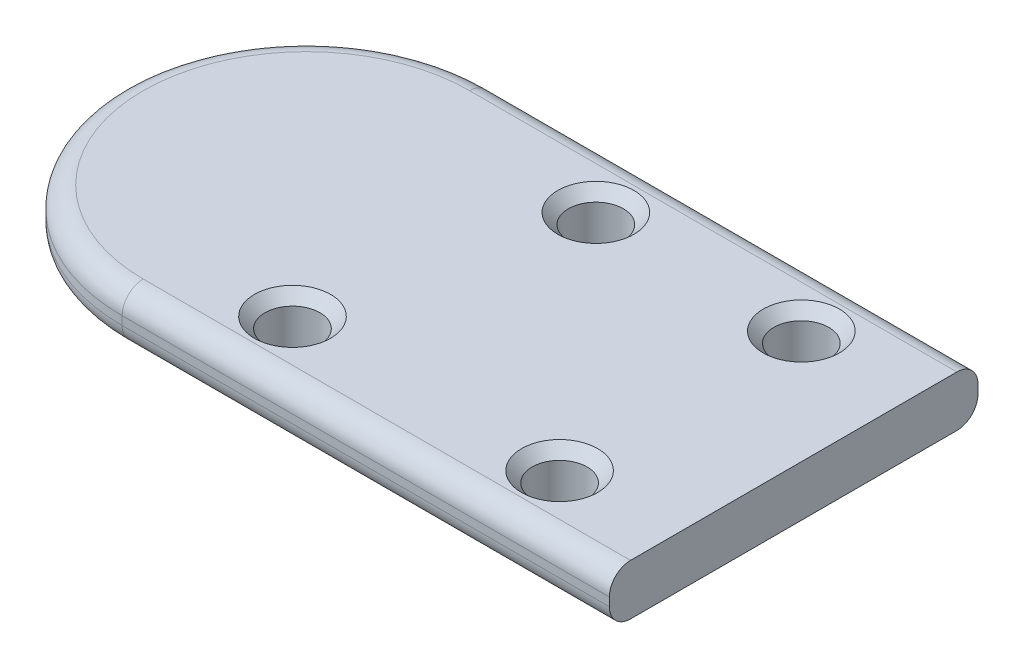
ISO-10303-21;
HEADER;
FILE_DESCRIPTION(('STEP AP214'),'2;1');
FILE_NAME('part.step','',(''),(''),'','','');
FILE_SCHEMA(('AUTOMOTIVE_DESIGN { 1 0 10303 214 1 1 1 1 }'));
ENDSEC;
DATA;
#1=APPLICATION_CONTEXT('core data for automotive mechanical design processes');
#2=APPLICATION_PROTOCOL_DEFINITION('international standard','automotive_design',2000,#1);
#3=PRODUCT_CONTEXT('',#1,'mechanical');
#4=PRODUCT('Part','Part','',(#3));
#5=PRODUCT_RELATED_PRODUCT_CATEGORY('part','',(#4));
#6=PRODUCT_DEFINITION_FORMATION('','',#4);
#7=PRODUCT_DEFINITION_CONTEXT('part definition',#1,'design');
#8=PRODUCT_DEFINITION('design','',#6,#7);
#9=PRODUCT_DEFINITION_SHAPE('','',#8);
#10=(LENGTH_UNIT() NAMED_UNIT(*) SI_UNIT(.MILLI.,.METRE.));
#11=(NAMED_UNIT(*) PLANE_ANGLE_UNIT() SI_UNIT($,.RADIAN.));
#12=(NAMED_UNIT(*) SI_UNIT($,.STERADIAN.) SOLID_ANGLE_UNIT());
#13=UNCERTAINTY_MEASURE_WITH_UNIT(LENGTH_MEASURE(1.E-05),#10,'distance_accuracy_value','');
#14=(GEOMETRIC_REPRESENTATION_CONTEXT(3) GLOBAL_UNCERTAINTY_ASSIGNED_CONTEXT((#13)) GLOBAL_UNIT_ASSIGNED_CONTEXT((#10,
#11,#12)) REPRESENTATION_CONTEXT('',''));
#15=CARTESIAN_POINT('',(0.,0.,0.));
#16=DIRECTION('',(0.,0.,1.));
#17=DIRECTION('',(1.,0.,0.));
#18=AXIS2_PLACEMENT_3D('',#15,#16,#17);
#19=CARTESIAN_POINT('',(-65.005,2.4,0.));
#20=DIRECTION('',(0.,-1.,0.));
#21=DIRECTION('',(0.,0.,-1.));
#22=AXIS2_PLACEMENT_3D('',#19,#20,#21);
#23=CYLINDRICAL_SURFACE('',#22,17.43);
#24=DIRECTION('',(0.,-1.,0.));
#25=VECTOR('',#24,1.);
#26=CARTESIAN_POINT('',(-65.005,2.4,17.43));
#27=LINE('',#26,#25);
#28=CARTESIAN_POINT('',(-65.005,0.4,17.43));
#29=VERTEX_POINT('',#28);
#30=CARTESIAN_POINT('',(-65.005,-0.4,17.43));
#31=VERTEX_POINT('',#30);
#32=EDGE_CURVE('E302',#29,#31,#27,.T.);
#33=ORIENTED_EDGE('',*,*,#32,.F.);
#34=CARTESIAN_POINT('',(-65.005,0.4,0.));
#35=DIRECTION('',(0.,1.,0.));
#36=DIRECTION('',(0.,0.,1.));
#37=AXIS2_PLACEMENT_3D('',#34,#35,#36);
#38=CIRCLE('',#37,17.43);
#39=CARTESIAN_POINT('',(-65.005,0.4,-17.43));
#40=VERTEX_POINT('',#39);
#41=EDGE_CURVE('E155',#29,#40,#38,.F.);
#42=ORIENTED_EDGE('',*,*,#41,.T.);
#43=DIRECTION('',(0.,-1.,0.));
#44=VECTOR('',#43,1.);
#45=CARTESIAN_POINT('',(-65.005,2.4,-17.43));
#46=LINE('',#45,#44);
#47=CARTESIAN_POINT('',(-65.005,-0.4,-17.43));
#48=VERTEX_POINT('',#47);
#49=EDGE_CURVE('E299',#40,#48,#46,.T.);
#50=ORIENTED_EDGE('',*,*,#49,.T.);
#51=CARTESIAN_POINT('',(-65.005,-0.4,0.));
#52=DIRECTION('',(0.,1.,0.));
#53=DIRECTION('',(0.,0.,1.));
#54=AXIS2_PLACEMENT_3D('',#51,#52,#53);
#55=CIRCLE('',#54,17.43);
#56=EDGE_CURVE('E64',#48,#31,#55,.T.);
#57=ORIENTED_EDGE('',*,*,#56,.T.);
#58=EDGE_LOOP('',(#33,#42,#50,#57));
#59=FACE_BOUND('',#58,.T.);
#60=ADVANCED_FACE('F40',(#59),#23,.T.);
#61=CARTESIAN_POINT('',(-65.005,2.4,17.43));
#62=DIRECTION('',(0.,0.,-1.));
#63=DIRECTION('',(-1.,0.,0.));
#64=AXIS2_PLACEMENT_3D('',#61,#62,#63);
#65=PLANE('',#64);
#66=DIRECTION('',(1.,0.,0.));
#67=VECTOR('',#66,1.);
#68=CARTESIAN_POINT('',(-65.005,-0.4,17.43));
#69=LINE('',#68,#67);
#70=CARTESIAN_POINT('',(-18.9276397409612,-0.399999999999999,17.4299999999999));
#71=VERTEX_POINT('',#70);
#72=EDGE_CURVE('E146',#31,#71,#69,.T.);
#73=ORIENTED_EDGE('',*,*,#72,.T.);
#74=DIRECTION('',(0.,1.,0.));
#75=VECTOR('',#74,1.);
#76=CARTESIAN_POINT('',(-18.9276397409612,-7.6,17.4299999999999));
#77=LINE('',#76,#75);
#78=CARTESIAN_POINT('',(-18.9276397409612,0.399999999999999,17.4299999999999));
#79=VERTEX_POINT('',#78);
#80=EDGE_CURVE('E122',#71,#79,#77,.T.);
#81=ORIENTED_EDGE('',*,*,#80,.T.);
#82=DIRECTION('',(1.,0.,0.));
#83=VECTOR('',#82,1.);
#84=CARTESIAN_POINT('',(-65.005,0.4,17.43));
#85=LINE('',#84,#83);
#86=EDGE_CURVE('E150',#79,#29,#85,.F.);
#87=ORIENTED_EDGE('',*,*,#86,.T.);
#88=ORIENTED_EDGE('',*,*,#32,.T.);
#89=EDGE_LOOP('',(#73,#81,#87,#88));
#90=FACE_BOUND('',#89,.T.);
#91=ADVANCED_FACE('F220',(#90),#65,.F.);
#92=CARTESIAN_POINT('',(-65.005,2.4,-17.43));
#93=DIRECTION('',(0.,0.,1.));
#94=DIRECTION('',(1.,0.,0.));
#95=AXIS2_PLACEMENT_3D('',#92,#93,#94);
#96=PLANE('',#95);
#97=DIRECTION('',(-1.,0.,0.));
#98=VECTOR('',#97,1.);
#99=CARTESIAN_POINT('',(65.005,0.4,-17.43));
#100=LINE('',#99,#98);
#101=CARTESIAN_POINT('',(-18.9276397409612,0.399999999999999,-17.43));
#102=VERTEX_POINT('',#101);
#103=EDGE_CURVE('E120',#40,#102,#100,.F.);
#104=ORIENTED_EDGE('',*,*,#103,.T.);
#105=DIRECTION('',(0.,1.,0.));
#106=VECTOR('',#105,1.);
#107=CARTESIAN_POINT('',(-18.9276397409612,-7.6,-17.43));
#108=LINE('',#107,#106);
#109=CARTESIAN_POINT('',(-18.9276397409612,-0.399999999999999,-17.43));
#110=VERTEX_POINT('',#109);
#111=EDGE_CURVE('E107',#110,#102,#108,.T.);
#112=ORIENTED_EDGE('',*,*,#111,.F.);
#113=DIRECTION('',(-1.,0.,0.));
#114=VECTOR('',#113,1.);
#115=CARTESIAN_POINT('',(-65.005,-0.4,-17.43));
#116=LINE('',#115,#114);
#117=EDGE_CURVE('E117',#110,#48,#116,.T.);
#118=ORIENTED_EDGE('',*,*,#117,.T.);
#119=ORIENTED_EDGE('',*,*,#49,.F.);
#120=EDGE_LOOP('',(#104,#112,#118,#119));
#121=FACE_BOUND('',#120,.T.);
#122=ADVANCED_FACE('F115',(#121),#96,.F.);
#123=CARTESIAN_POINT('',(-65.005,2.4,0.));
#124=DIRECTION('',(0.,1.,0.));
#125=DIRECTION('',(0.,0.,1.));
#126=AXIS2_PLACEMENT_3D('',#123,#124,#125);
#127=PLANE('',#126);
#128=DIRECTION('',(0.,0.,1.));
#129=VECTOR('',#128,1.);
#130=CARTESIAN_POINT('',(-18.9276397409612,2.4,-17.43));
#131=LINE('',#130,#129);
#132=CARTESIAN_POINT('',(-18.9276397409612,2.4,-15.43));
#133=VERTEX_POINT('',#132);
#134=CARTESIAN_POINT('',(-18.9276397409612,2.4,15.4299999999999));
#135=VERTEX_POINT('',#134);
#136=EDGE_CURVE('E314',#133,#135,#131,.T.);
#137=ORIENTED_EDGE('',*,*,#136,.F.);
#138=DIRECTION('',(-1.,0.,0.));
#139=VECTOR('',#138,1.);
#140=CARTESIAN_POINT('',(-65.005,2.4,-15.43));
#141=LINE('',#140,#139);
#142=CARTESIAN_POINT('',(-65.005,2.4,-15.43));
#143=VERTEX_POINT('',#142);
#144=EDGE_CURVE('E128',#133,#143,#141,.T.);
#145=ORIENTED_EDGE('',*,*,#144,.T.);
#146=CARTESIAN_POINT('',(-65.005,2.4,0.));
#147=DIRECTION('',(0.,1.,0.));
#148=DIRECTION('',(0.,0.,1.));
#149=AXIS2_PLACEMENT_3D('',#146,#147,#148);
#150=CIRCLE('',#149,15.43);
#151=CARTESIAN_POINT('',(-65.005,2.4,15.4299999999999));
#152=VERTEX_POINT('',#151);
#153=EDGE_CURVE('E305',#143,#152,#150,.T.);
#154=ORIENTED_EDGE('',*,*,#153,.T.);
#155=DIRECTION('',(1.,0.,0.));
#156=VECTOR('',#155,1.);
#157=CARTESIAN_POINT('',(65.005,2.4,15.4299999999999));
#158=LINE('',#157,#156);
#159=EDGE_CURVE('E134',#152,#135,#158,.T.);
#160=ORIENTED_EDGE('',*,*,#159,.T.);
#161=EDGE_LOOP('',(#137,#145,#154,#160));
#162=FACE_BOUND('',#161,.T.);
#163=CARTESIAN_POINT('',(-29.635,2.4,11.43));
#164=DIRECTION('',(0.,1.,0.));
#165=DIRECTION('',(0.,0.,1.));
#166=AXIS2_PLACEMENT_3D('',#163,#164,#165);
#167=CIRCLE('',#166,3.59999999999998);
#168=CARTESIAN_POINT('',(-29.635,2.4,15.0299999999999));
#169=VERTEX_POINT('',#168);
#170=EDGE_CURVE('E190',#169,#169,#167,.F.);
#171=ORIENTED_EDGE('',*,*,#170,.T.);
#172=EDGE_LOOP('',(#171));
#173=FACE_BOUND('',#172,.T.);
#174=CARTESIAN_POINT('',(-54.895,2.4,11.43));
#175=DIRECTION('',(0.,1.,0.));
#176=DIRECTION('',(0.,0.,1.));
#177=AXIS2_PLACEMENT_3D('',#174,#175,#176);
#178=CIRCLE('',#177,3.59999999999998);
#179=CARTESIAN_POINT('',(-54.895,2.4,15.0299999999999));
#180=VERTEX_POINT('',#179);
#181=EDGE_CURVE('E186',#180,#180,#178,.F.);
#182=ORIENTED_EDGE('',*,*,#181,.T.);
#183=EDGE_LOOP('',(#182));
#184=FACE_BOUND('',#183,.T.);
#185=CARTESIAN_POINT('',(-29.635,2.4,-11.43));
#186=DIRECTION('',(0.,1.,0.));
#187=DIRECTION('',(0.,0.,1.));
#188=AXIS2_PLACEMENT_3D('',#185,#186,#187);
#189=CIRCLE('',#188,3.60000000000002);
#190=CARTESIAN_POINT('',(-29.635,2.4,-7.82999999999996));
#191=VERTEX_POINT('',#190);
#192=EDGE_CURVE('E182',#191,#191,#189,.F.);
#193=ORIENTED_EDGE('',*,*,#192,.T.);
#194=EDGE_LOOP('',(#193));
#195=FACE_BOUND('',#194,.T.);
#196=CARTESIAN_POINT('',(-49.065,2.4,-11.43));
#197=DIRECTION('',(0.,1.,0.));
#198=DIRECTION('',(0.,0.,1.));
#199=AXIS2_PLACEMENT_3D('',#196,#197,#198);
#200=CIRCLE('',#199,3.60000000000002);
#201=CARTESIAN_POINT('',(-49.065,2.4,-7.82999999999996));
#202=VERTEX_POINT('',#201);
#203=EDGE_CURVE('E178',#202,#202,#200,.F.);
#204=ORIENTED_EDGE('',*,*,#203,.T.);
#205=EDGE_LOOP('',(#204));
#206=FACE_BOUND('',#205,.T.);
#207=ADVANCED_FACE('F312',(#162,#173,#184,#195,#206),#127,.T.);
#208=CARTESIAN_POINT('',(-65.005,-2.4,0.));
#209=DIRECTION('',(0.,1.,0.));
#210=DIRECTION('',(0.,0.,1.));
#211=AXIS2_PLACEMENT_3D('',#208,#209,#210);
#212=PLANE('',#211);
#213=DIRECTION('',(-1.,0.,0.));
#214=VECTOR('',#213,1.);
#215=CARTESIAN_POINT('',(-65.005,-2.4,-15.43));
#216=LINE('',#215,#214);
#217=CARTESIAN_POINT('',(-65.005,-2.4,-15.43));
#218=VERTEX_POINT('',#217);
#219=CARTESIAN_POINT('',(-18.9276397409612,-2.4,-15.43));
#220=VERTEX_POINT('',#219);
#221=EDGE_CURVE('E143',#218,#220,#216,.F.);
#222=ORIENTED_EDGE('',*,*,#221,.T.);
#223=DIRECTION('',(0.,0.,1.));
#224=VECTOR('',#223,1.);
#225=CARTESIAN_POINT('',(-18.9276397409612,-2.4,0.));
#226=LINE('',#225,#224);
#227=CARTESIAN_POINT('',(-18.9276397409612,-2.4,15.4299999999999));
#228=VERTEX_POINT('',#227);
#229=EDGE_CURVE('E56',#220,#228,#226,.T.);
#230=ORIENTED_EDGE('',*,*,#229,.T.);
#231=DIRECTION('',(1.,0.,0.));
#232=VECTOR('',#231,1.);
#233=CARTESIAN_POINT('',(-65.005,-2.4,15.43));
#234=LINE('',#233,#232);
#235=CARTESIAN_POINT('',(-65.005,-2.4,15.4299999999999));
#236=VERTEX_POINT('',#235);
#237=EDGE_CURVE('E140',#228,#236,#234,.F.);
#238=ORIENTED_EDGE('',*,*,#237,.T.);
#239=CARTESIAN_POINT('',(-65.005,-2.4,0.));
#240=DIRECTION('',(0.,1.,0.));
#241=DIRECTION('',(0.,0.,1.));
#242=AXIS2_PLACEMENT_3D('',#239,#240,#241);
#243=CIRCLE('',#242,15.43);
#244=EDGE_CURVE('E132',#236,#218,#243,.F.);
#245=ORIENTED_EDGE('',*,*,#244,.T.);
#246=EDGE_LOOP('',(#222,#230,#238,#245));
#247=FACE_BOUND('',#246,.T.);
#248=CARTESIAN_POINT('',(-29.635,-2.4,-11.43));
#249=DIRECTION('',(0.,1.,0.));
#250=DIRECTION('',(0.,0.,1.));
#251=AXIS2_PLACEMENT_3D('',#248,#249,#250);
#252=CIRCLE('',#251,2.6);
#253=CARTESIAN_POINT('',(-29.635,-2.4,-8.82999999999998));
#254=VERTEX_POINT('',#253);
#255=EDGE_CURVE('E286',#254,#254,#252,.F.);
#256=ORIENTED_EDGE('',*,*,#255,.F.);
#257=EDGE_LOOP('',(#256));
#258=FACE_BOUND('',#257,.T.);
#259=CARTESIAN_POINT('',(-54.895,-2.4,11.43));
#260=DIRECTION('',(0.,1.,0.));
#261=DIRECTION('',(0.,0.,1.));
#262=AXIS2_PLACEMENT_3D('',#259,#260,#261);
#263=CIRCLE('',#262,2.6);
#264=CARTESIAN_POINT('',(-54.895,-2.4,14.03));
#265=VERTEX_POINT('',#264);
#266=EDGE_CURVE('E283',#265,#265,#263,.F.);
#267=ORIENTED_EDGE('',*,*,#266,.F.);
#268=EDGE_LOOP('',(#267));
#269=FACE_BOUND('',#268,.T.);
#270=CARTESIAN_POINT('',(-29.635,-2.4,11.43));
#271=DIRECTION('',(0.,1.,0.));
#272=DIRECTION('',(0.,0.,1.));
#273=AXIS2_PLACEMENT_3D('',#270,#271,#272);
#274=CIRCLE('',#273,2.6);
#275=CARTESIAN_POINT('',(-29.635,-2.4,14.03));
#276=VERTEX_POINT('',#275);
#277=EDGE_CURVE('E168',#276,#276,#274,.F.);
#278=ORIENTED_EDGE('',*,*,#277,.F.);
#279=EDGE_LOOP('',(#278));
#280=FACE_BOUND('',#279,.T.);
#281=CARTESIAN_POINT('',(-49.065,-2.4,-11.43));
#282=DIRECTION('',(0.,1.,0.));
#283=DIRECTION('',(0.,0.,1.));
#284=AXIS2_PLACEMENT_3D('',#281,#282,#283);
#285=CIRCLE('',#284,2.6);
#286=CARTESIAN_POINT('',(-49.065,-2.4,-8.82999999999999));
#287=VERTEX_POINT('',#286);
#288=EDGE_CURVE('E291',#287,#287,#285,.F.);
#289=ORIENTED_EDGE('',*,*,#288,.F.);
#290=EDGE_LOOP('',(#289));
#291=FACE_BOUND('',#290,.T.);
#292=ADVANCED_FACE('F343',(#247,#258,#269,#280,#291),#212,.F.);
#293=CARTESIAN_POINT('',(-49.065,-2.401,-11.43));
#294=DIRECTION('',(0.,1.,0.));
#295=DIRECTION('',(0.,0.,1.));
#296=AXIS2_PLACEMENT_3D('',#293,#294,#295);
#297=CYLINDRICAL_SURFACE('',#296,2.6);
#298=CARTESIAN_POINT('',(-49.065,1.39999999999998,-11.43));
#299=DIRECTION('',(0.,1.,0.));
#300=DIRECTION('',(0.,0.,1.));
#301=AXIS2_PLACEMENT_3D('',#298,#299,#300);
#302=CIRCLE('',#301,2.6);
#303=CARTESIAN_POINT('',(-49.065,1.39999999999998,-8.82999999999999));
#304=VERTEX_POINT('',#303);
#305=EDGE_CURVE('E50',#304,#304,#302,.T.);
#306=ORIENTED_EDGE('',*,*,#305,.T.);
#307=EDGE_LOOP('',(#306));
#308=FACE_BOUND('',#307,.T.);
#309=ORIENTED_EDGE('',*,*,#288,.T.);
#310=EDGE_LOOP('',(#309));
#311=FACE_BOUND('',#310,.T.);
#312=ADVANCED_FACE('F205',(#308,#311),#297,.F.);
#313=CARTESIAN_POINT('',(-29.635,-2.401,11.43));
#314=DIRECTION('',(0.,1.,0.));
#315=DIRECTION('',(0.,0.,1.));
#316=AXIS2_PLACEMENT_3D('',#313,#314,#315);
#317=CYLINDRICAL_SURFACE('',#316,2.6);
#318=CARTESIAN_POINT('',(-29.635,1.40000000000001,11.43));
#319=DIRECTION('',(0.,1.,0.));
#320=DIRECTION('',(0.,0.,1.));
#321=AXIS2_PLACEMENT_3D('',#318,#319,#320);
#322=CIRCLE('',#321,2.6);
#323=CARTESIAN_POINT('',(-29.635,1.40000000000001,14.03));
#324=VERTEX_POINT('',#323);
#325=EDGE_CURVE('E158',#324,#324,#322,.T.);
#326=ORIENTED_EDGE('',*,*,#325,.T.);
#327=EDGE_LOOP('',(#326));
#328=FACE_BOUND('',#327,.T.);
#329=ORIENTED_EDGE('',*,*,#277,.T.);
#330=EDGE_LOOP('',(#329));
#331=FACE_BOUND('',#330,.T.);
#332=ADVANCED_FACE('F279',(#328,#331),#317,.F.);
#333=CARTESIAN_POINT('',(-54.895,-2.401,11.43));
#334=DIRECTION('',(0.,1.,0.));
#335=DIRECTION('',(0.,0.,1.));
#336=AXIS2_PLACEMENT_3D('',#333,#334,#335);
#337=CYLINDRICAL_SURFACE('',#336,2.6);
#338=CARTESIAN_POINT('',(-54.895,1.40000000000001,11.43));
#339=DIRECTION('',(0.,1.,0.));
#340=DIRECTION('',(0.,0.,1.));
#341=AXIS2_PLACEMENT_3D('',#338,#339,#340);
#342=CIRCLE('',#341,2.6);
#343=CARTESIAN_POINT('',(-54.895,1.40000000000001,14.03));
#344=VERTEX_POINT('',#343);
#345=EDGE_CURVE('E194',#344,#344,#342,.T.);
#346=ORIENTED_EDGE('',*,*,#345,.T.);
#347=EDGE_LOOP('',(#346));
#348=FACE_BOUND('',#347,.T.);
#349=ORIENTED_EDGE('',*,*,#266,.T.);
#350=EDGE_LOOP('',(#349));
#351=FACE_BOUND('',#350,.T.);
#352=ADVANCED_FACE('F276',(#348,#351),#337,.F.);
#353=CARTESIAN_POINT('',(-29.635,-2.401,-11.43));
#354=DIRECTION('',(0.,1.,0.));
#355=DIRECTION('',(0.,0.,1.));
#356=AXIS2_PLACEMENT_3D('',#353,#354,#355);
#357=CYLINDRICAL_SURFACE('',#356,2.6);
#358=CARTESIAN_POINT('',(-29.635,1.39999999999998,-11.43));
#359=DIRECTION('',(0.,1.,0.));
#360=DIRECTION('',(0.,0.,1.));
#361=AXIS2_PLACEMENT_3D('',#358,#359,#360);
#362=CIRCLE('',#361,2.6);
#363=CARTESIAN_POINT('',(-29.635,1.39999999999998,-8.82999999999998));
#364=VERTEX_POINT('',#363);
#365=EDGE_CURVE('E198',#364,#364,#362,.T.);
#366=ORIENTED_EDGE('',*,*,#365,.T.);
#367=EDGE_LOOP('',(#366));
#368=FACE_BOUND('',#367,.T.);
#369=ORIENTED_EDGE('',*,*,#255,.T.);
#370=EDGE_LOOP('',(#369));
#371=FACE_BOUND('',#370,.T.);
#372=ADVANCED_FACE('F242',(#368,#371),#357,.F.);
#373=CARTESIAN_POINT('',(-65.005,0.4,15.43));
#374=DIRECTION('',(-1.,0.,0.));
#375=DIRECTION('',(0.,0.,1.));
#376=AXIS2_PLACEMENT_3D('',#373,#374,#375);
#377=CYLINDRICAL_SURFACE('',#376,2.);
#378=CARTESIAN_POINT('',(-18.9276397409612,0.4,15.4299999999999));
#379=DIRECTION('',(-1.,0.,0.));
#380=DIRECTION('',(0.,0.,1.));
#381=AXIS2_PLACEMENT_3D('',#378,#379,#380);
#382=CIRCLE('',#381,2.);
#383=EDGE_CURVE('E171',#135,#79,#382,.F.);
#384=ORIENTED_EDGE('',*,*,#383,.F.);
#385=ORIENTED_EDGE('',*,*,#159,.F.);
#386=CARTESIAN_POINT('',(-65.005,0.4,15.43));
#387=DIRECTION('',(-1.,0.,0.));
#388=DIRECTION('',(0.,0.,1.));
#389=AXIS2_PLACEMENT_3D('',#386,#387,#388);
#390=CIRCLE('',#389,2.);
#391=EDGE_CURVE('E163',#29,#152,#390,.T.);
#392=ORIENTED_EDGE('',*,*,#391,.F.);
#393=ORIENTED_EDGE('',*,*,#86,.F.);
#394=EDGE_LOOP('',(#384,#385,#392,#393));
#395=FACE_BOUND('',#394,.T.);
#396=ADVANCED_FACE('F238',(#395),#377,.T.);
#397=CARTESIAN_POINT('',(-65.005,0.4,0.));
#398=DIRECTION('',(0.,1.,0.));
#399=DIRECTION('',(0.,0.,1.));
#400=AXIS2_PLACEMENT_3D('',#397,#398,#399);
#401=TOROIDAL_SURFACE('',#400,15.43,2.);
#402=ORIENTED_EDGE('',*,*,#391,.T.);
#403=ORIENTED_EDGE('',*,*,#153,.F.);
#404=CARTESIAN_POINT('',(-65.005,0.4,-15.43));
#405=DIRECTION('',(1.,0.,0.));
#406=DIRECTION('',(0.,0.,-1.));
#407=AXIS2_PLACEMENT_3D('',#404,#405,#406);
#408=CIRCLE('',#407,2.);
#409=EDGE_CURVE('E159',#40,#143,#408,.T.);
#410=ORIENTED_EDGE('',*,*,#409,.F.);
#411=ORIENTED_EDGE('',*,*,#41,.F.);
#412=EDGE_LOOP('',(#402,#403,#410,#411));
#413=FACE_BOUND('',#412,.T.);
#414=ADVANCED_FACE('F234',(#413),#401,.T.);
#415=CARTESIAN_POINT('',(-65.005,0.4,-15.43));
#416=DIRECTION('',(1.,0.,0.));
#417=DIRECTION('',(0.,0.,-1.));
#418=AXIS2_PLACEMENT_3D('',#415,#416,#417);
#419=CYLINDRICAL_SURFACE('',#418,2.);
#420=CARTESIAN_POINT('',(-18.9276397409612,0.4,-15.43));
#421=DIRECTION('',(-1.,0.,0.));
#422=DIRECTION('',(0.,0.,1.));
#423=AXIS2_PLACEMENT_3D('',#420,#421,#422);
#424=CIRCLE('',#423,2.);
#425=EDGE_CURVE('E322',#102,#133,#424,.F.);
#426=ORIENTED_EDGE('',*,*,#425,.F.);
#427=ORIENTED_EDGE('',*,*,#103,.F.);
#428=ORIENTED_EDGE('',*,*,#409,.T.);
#429=ORIENTED_EDGE('',*,*,#144,.F.);
#430=EDGE_LOOP('',(#426,#427,#428,#429));
#431=FACE_BOUND('',#430,.T.);
#432=ADVANCED_FACE('F230',(#431),#419,.T.);
#433=CARTESIAN_POINT('',(-65.005,-0.4,15.43));
#434=DIRECTION('',(1.,0.,0.));
#435=DIRECTION('',(0.,0.,-1.));
#436=AXIS2_PLACEMENT_3D('',#433,#434,#435);
#437=CYLINDRICAL_SURFACE('',#436,2.);
#438=CARTESIAN_POINT('',(-18.9276397409612,-0.4,15.4299999999999));
#439=DIRECTION('',(-1.,0.,0.));
#440=DIRECTION('',(0.,0.,1.));
#441=AXIS2_PLACEMENT_3D('',#438,#439,#440);
#442=CIRCLE('',#441,2.);
#443=EDGE_CURVE('E324',#71,#228,#442,.F.);
#444=ORIENTED_EDGE('',*,*,#443,.F.);
#445=ORIENTED_EDGE('',*,*,#72,.F.);
#446=CARTESIAN_POINT('',(-65.005,-0.4,15.43));
#447=DIRECTION('',(-1.,0.,0.));
#448=DIRECTION('',(0.,0.,1.));
#449=AXIS2_PLACEMENT_3D('',#446,#447,#448);
#450=CIRCLE('',#449,2.);
#451=EDGE_CURVE('E164',#236,#31,#450,.T.);
#452=ORIENTED_EDGE('',*,*,#451,.F.);
#453=ORIENTED_EDGE('',*,*,#237,.F.);
#454=EDGE_LOOP('',(#444,#445,#452,#453));
#455=FACE_BOUND('',#454,.T.);
#456=ADVANCED_FACE('F233',(#455),#437,.T.);
#457=CARTESIAN_POINT('',(-65.005,-0.4,0.));
#458=DIRECTION('',(0.,1.,0.));
#459=DIRECTION('',(0.,0.,1.));
#460=AXIS2_PLACEMENT_3D('',#457,#458,#459);
#461=TOROIDAL_SURFACE('',#460,15.43,2.);
#462=ORIENTED_EDGE('',*,*,#451,.T.);
#463=ORIENTED_EDGE('',*,*,#56,.F.);
#464=CARTESIAN_POINT('',(-65.005,-0.4,-15.43));
#465=DIRECTION('',(1.,0.,0.));
#466=DIRECTION('',(0.,0.,-1.));
#467=AXIS2_PLACEMENT_3D('',#464,#465,#466);
#468=CIRCLE('',#467,2.);
#469=EDGE_CURVE('E126',#218,#48,#468,.T.);
#470=ORIENTED_EDGE('',*,*,#469,.F.);
#471=ORIENTED_EDGE('',*,*,#244,.F.);
#472=EDGE_LOOP('',(#462,#463,#470,#471));
#473=FACE_BOUND('',#472,.T.);
#474=ADVANCED_FACE('F247',(#473),#461,.T.);
#475=CARTESIAN_POINT('',(-65.005,-0.4,-15.43));
#476=DIRECTION('',(-1.,0.,0.));
#477=DIRECTION('',(0.,0.,1.));
#478=AXIS2_PLACEMENT_3D('',#475,#476,#477);
#479=CYLINDRICAL_SURFACE('',#478,2.);
#480=CARTESIAN_POINT('',(-18.9276397409612,-0.4,-15.43));
#481=DIRECTION('',(-1.,0.,0.));
#482=DIRECTION('',(0.,0.,1.));
#483=AXIS2_PLACEMENT_3D('',#480,#481,#482);
#484=CIRCLE('',#483,2.);
#485=EDGE_CURVE('E11',#220,#110,#484,.F.);
#486=ORIENTED_EDGE('',*,*,#485,.F.);
#487=ORIENTED_EDGE('',*,*,#221,.F.);
#488=ORIENTED_EDGE('',*,*,#469,.T.);
#489=ORIENTED_EDGE('',*,*,#117,.F.);
#490=EDGE_LOOP('',(#486,#487,#488,#489));
#491=FACE_BOUND('',#490,.T.);
#492=ADVANCED_FACE('F124',(#491),#479,.T.);
#493=CARTESIAN_POINT('',(-29.635,1.40000000000001,11.43));
#494=DIRECTION('',(0.,1.,0.));
#495=DIRECTION('',(0.,0.,1.));
#496=AXIS2_PLACEMENT_3D('',#493,#494,#495);
#497=CONICAL_SURFACE('',#496,2.6,0.785398163397444);
#498=ORIENTED_EDGE('',*,*,#170,.F.);
#499=EDGE_LOOP('',(#498));
#500=FACE_BOUND('',#499,.T.);
#501=ORIENTED_EDGE('',*,*,#325,.F.);
#502=EDGE_LOOP('',(#501));
#503=FACE_BOUND('',#502,.T.);
#504=ADVANCED_FACE('F246',(#500,#503),#497,.F.);
#505=CARTESIAN_POINT('',(-54.895,1.40000000000001,11.43));
#506=DIRECTION('',(0.,1.,0.));
#507=DIRECTION('',(0.,0.,1.));
#508=AXIS2_PLACEMENT_3D('',#505,#506,#507);
#509=CONICAL_SURFACE('',#508,2.6,0.785398163397444);
#510=ORIENTED_EDGE('',*,*,#181,.F.);
#511=EDGE_LOOP('',(#510));
#512=FACE_BOUND('',#511,.T.);
#513=ORIENTED_EDGE('',*,*,#345,.F.);
#514=EDGE_LOOP('',(#513));
#515=FACE_BOUND('',#514,.T.);
#516=ADVANCED_FACE('F216',(#512,#515),#509,.F.);
#517=CARTESIAN_POINT('',(-29.635,1.39999999999998,-11.43));
#518=DIRECTION('',(0.,1.,0.));
#519=DIRECTION('',(0.,0.,1.));
#520=AXIS2_PLACEMENT_3D('',#517,#518,#519);
#521=CONICAL_SURFACE('',#520,2.6,0.785398163397451);
#522=ORIENTED_EDGE('',*,*,#192,.F.);
#523=EDGE_LOOP('',(#522));
#524=FACE_BOUND('',#523,.T.);
#525=ORIENTED_EDGE('',*,*,#365,.F.);
#526=EDGE_LOOP('',(#525));
#527=FACE_BOUND('',#526,.T.);
#528=ADVANCED_FACE('F209',(#524,#527),#521,.F.);
#529=CARTESIAN_POINT('',(-49.065,1.39999999999998,-11.43));
#530=DIRECTION('',(0.,1.,0.));
#531=DIRECTION('',(0.,0.,1.));
#532=AXIS2_PLACEMENT_3D('',#529,#530,#531);
#533=CONICAL_SURFACE('',#532,2.6,0.785398163397451);
#534=ORIENTED_EDGE('',*,*,#203,.F.);
#535=EDGE_LOOP('',(#534));
#536=FACE_BOUND('',#535,.T.);
#537=ORIENTED_EDGE('',*,*,#305,.F.);
#538=EDGE_LOOP('',(#537));
#539=FACE_BOUND('',#538,.T.);
#540=ADVANCED_FACE('F43',(#536,#539),#533,.F.);
#541=CARTESIAN_POINT('',(-18.9276397409612,-7.6,-17.43));
#542=DIRECTION('',(-1.,0.,0.));
#543=DIRECTION('',(0.,0.,1.));
#544=AXIS2_PLACEMENT_3D('',#541,#542,#543);
#545=PLANE('',#544);
#546=ORIENTED_EDGE('',*,*,#383,.T.);
#547=ORIENTED_EDGE('',*,*,#80,.F.);
#548=ORIENTED_EDGE('',*,*,#443,.T.);
#549=ORIENTED_EDGE('',*,*,#229,.F.);
#550=ORIENTED_EDGE('',*,*,#485,.T.);
#551=ORIENTED_EDGE('',*,*,#111,.T.);
#552=ORIENTED_EDGE('',*,*,#425,.T.);
#553=ORIENTED_EDGE('',*,*,#136,.T.);
#554=EDGE_LOOP('',(#546,#547,#548,#549,#550,#551,#552,#553));
#555=FACE_BOUND('',#554,.T.);
#556=ADVANCED_FACE('F106',(#555),#545,.F.);
#557=CLOSED_SHELL('',(#60,#91,#122,#207,#292,#312,#332,#352,#372,#396,#414,#432,#456,#474,#492,
#504,#516,#528,#540,#556));
#558=MANIFOLD_SOLID_BREP('B2',#557);
#559=ADVANCED_BREP_SHAPE_REPRESENTATION('',(#18,#558),#14);
#560=SHAPE_DEFINITION_REPRESENTATION(#9,#559);
ENDSEC;
END-ISO-10303-21;
